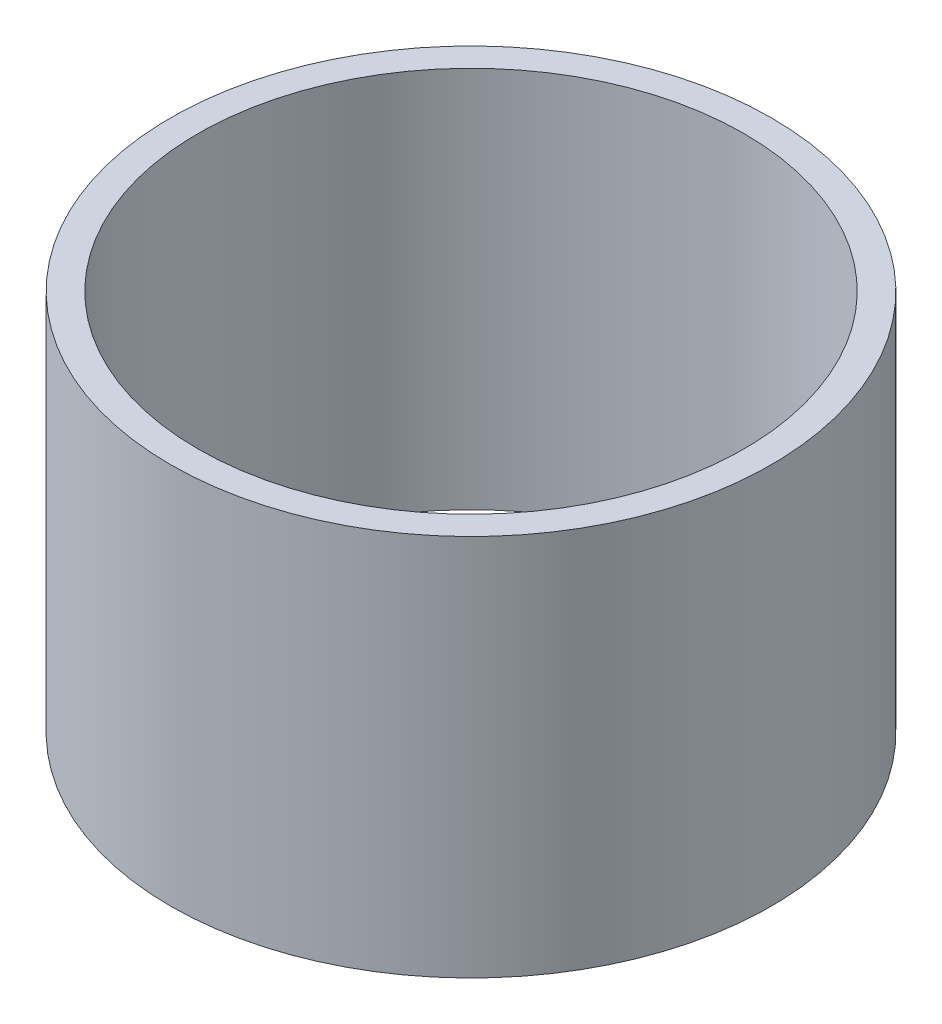
ISO-10303-21;
HEADER;
FILE_DESCRIPTION(('STEP AP214'),'2;1');
FILE_NAME('part.step','',(''),(''),'','','');
FILE_SCHEMA(('AUTOMOTIVE_DESIGN { 1 0 10303 214 1 1 1 1 }'));
ENDSEC;
DATA;
#1=APPLICATION_CONTEXT('core data for automotive mechanical design processes');
#2=APPLICATION_PROTOCOL_DEFINITION('international standard','automotive_design',2000,#1);
#3=PRODUCT_CONTEXT('',#1,'mechanical');
#4=PRODUCT('Part','Part','',(#3));
#5=PRODUCT_RELATED_PRODUCT_CATEGORY('part','',(#4));
#6=PRODUCT_DEFINITION_FORMATION('','',#4);
#7=PRODUCT_DEFINITION_CONTEXT('part definition',#1,'design');
#8=PRODUCT_DEFINITION('design','',#6,#7);
#9=PRODUCT_DEFINITION_SHAPE('','',#8);
#10=(LENGTH_UNIT() NAMED_UNIT(*) SI_UNIT(.MILLI.,.METRE.));
#11=(NAMED_UNIT(*) PLANE_ANGLE_UNIT() SI_UNIT($,.RADIAN.));
#12=(NAMED_UNIT(*) SI_UNIT($,.STERADIAN.) SOLID_ANGLE_UNIT());
#13=UNCERTAINTY_MEASURE_WITH_UNIT(LENGTH_MEASURE(1.E-05),#10,'distance_accuracy_value','');
#14=(GEOMETRIC_REPRESENTATION_CONTEXT(3) GLOBAL_UNCERTAINTY_ASSIGNED_CONTEXT((#13)) GLOBAL_UNIT_ASSIGNED_CONTEXT((#10,
#11,#12)) REPRESENTATION_CONTEXT('',''));
#15=CARTESIAN_POINT('',(0.,0.,0.));
#16=DIRECTION('',(0.,0.,1.));
#17=DIRECTION('',(1.,0.,0.));
#18=AXIS2_PLACEMENT_3D('',#15,#16,#17);
#19=CARTESIAN_POINT('',(0.,88.9,0.));
#20=DIRECTION('',(0.,1.,0.));
#21=DIRECTION('',(0.,0.,1.));
#22=AXIS2_PLACEMENT_3D('',#19,#20,#21);
#23=PLANE('',#22);
#24=CARTESIAN_POINT('',(0.,88.9,0.));
#25=DIRECTION('',(0.,1.,0.));
#26=DIRECTION('',(0.,0.,1.));
#27=AXIS2_PLACEMENT_3D('',#24,#25,#26);
#28=CIRCLE('',#27,69.85);
#29=CARTESIAN_POINT('',(0.,88.9,69.85));
#30=VERTEX_POINT('',#29);
#31=EDGE_CURVE('E10',#30,#30,#28,.T.);
#32=ORIENTED_EDGE('',*,*,#31,.T.);
#33=EDGE_LOOP('',(#32));
#34=FACE_BOUND('',#33,.T.);
#35=CARTESIAN_POINT('',(0.,88.9,0.));
#36=DIRECTION('',(0.,1.,0.));
#37=DIRECTION('',(0.,0.,1.));
#38=AXIS2_PLACEMENT_3D('',#35,#36,#37);
#39=CIRCLE('',#38,63.5);
#40=CARTESIAN_POINT('',(0.,88.9,63.5));
#41=VERTEX_POINT('',#40);
#42=EDGE_CURVE('E50',#41,#41,#39,.T.);
#43=ORIENTED_EDGE('',*,*,#42,.F.);
#44=EDGE_LOOP('',(#43));
#45=FACE_BOUND('',#44,.T.);
#46=ADVANCED_FACE('F37',(#34,#45),#23,.T.);
#47=CARTESIAN_POINT('',(0.,0.,0.));
#48=DIRECTION('',(0.,1.,0.));
#49=DIRECTION('',(0.,0.,1.));
#50=AXIS2_PLACEMENT_3D('',#47,#48,#49);
#51=PLANE('',#50);
#52=CARTESIAN_POINT('',(0.,0.,0.));
#53=DIRECTION('',(0.,1.,0.));
#54=DIRECTION('',(0.,0.,1.));
#55=AXIS2_PLACEMENT_3D('',#52,#53,#54);
#56=CIRCLE('',#55,69.85);
#57=CARTESIAN_POINT('',(0.,0.,69.85));
#58=VERTEX_POINT('',#57);
#59=EDGE_CURVE('E41',#58,#58,#56,.T.);
#60=ORIENTED_EDGE('',*,*,#59,.F.);
#61=EDGE_LOOP('',(#60));
#62=FACE_BOUND('',#61,.T.);
#63=CARTESIAN_POINT('',(0.,0.,0.));
#64=DIRECTION('',(0.,1.,0.));
#65=DIRECTION('',(0.,0.,1.));
#66=AXIS2_PLACEMENT_3D('',#63,#64,#65);
#67=CIRCLE('',#66,63.5);
#68=CARTESIAN_POINT('',(0.,0.,63.5));
#69=VERTEX_POINT('',#68);
#70=EDGE_CURVE('E52',#69,#69,#67,.T.);
#71=ORIENTED_EDGE('',*,*,#70,.T.);
#72=EDGE_LOOP('',(#71));
#73=FACE_BOUND('',#72,.T.);
#74=ADVANCED_FACE('F64',(#62,#73),#51,.F.);
#75=CARTESIAN_POINT('',(0.,88.9,0.));
#76=DIRECTION('',(0.,-1.,0.));
#77=DIRECTION('',(0.,0.,-1.));
#78=AXIS2_PLACEMENT_3D('',#75,#76,#77);
#79=CYLINDRICAL_SURFACE('',#78,69.85);
#80=ORIENTED_EDGE('',*,*,#31,.F.);
#81=EDGE_LOOP('',(#80));
#82=FACE_BOUND('',#81,.T.);
#83=ORIENTED_EDGE('',*,*,#59,.T.);
#84=EDGE_LOOP('',(#83));
#85=FACE_BOUND('',#84,.T.);
#86=ADVANCED_FACE('F39',(#82,#85),#79,.T.);
#87=CARTESIAN_POINT('',(0.,88.9,0.));
#88=DIRECTION('',(0.,-1.,0.));
#89=DIRECTION('',(0.,0.,-1.));
#90=AXIS2_PLACEMENT_3D('',#87,#88,#89);
#91=CYLINDRICAL_SURFACE('',#90,63.5);
#92=ORIENTED_EDGE('',*,*,#42,.T.);
#93=EDGE_LOOP('',(#92));
#94=FACE_BOUND('',#93,.T.);
#95=ORIENTED_EDGE('',*,*,#70,.F.);
#96=EDGE_LOOP('',(#95));
#97=FACE_BOUND('',#96,.T.);
#98=ADVANCED_FACE('F60',(#94,#97),#91,.F.);
#99=CLOSED_SHELL('',(#46,#74,#86,#98));
#100=MANIFOLD_SOLID_BREP('B2',#99);
#101=ADVANCED_BREP_SHAPE_REPRESENTATION('',(#18,#100),#14);
#102=SHAPE_DEFINITION_REPRESENTATION(#9,#101);
ENDSEC;
END-ISO-10303-21;
